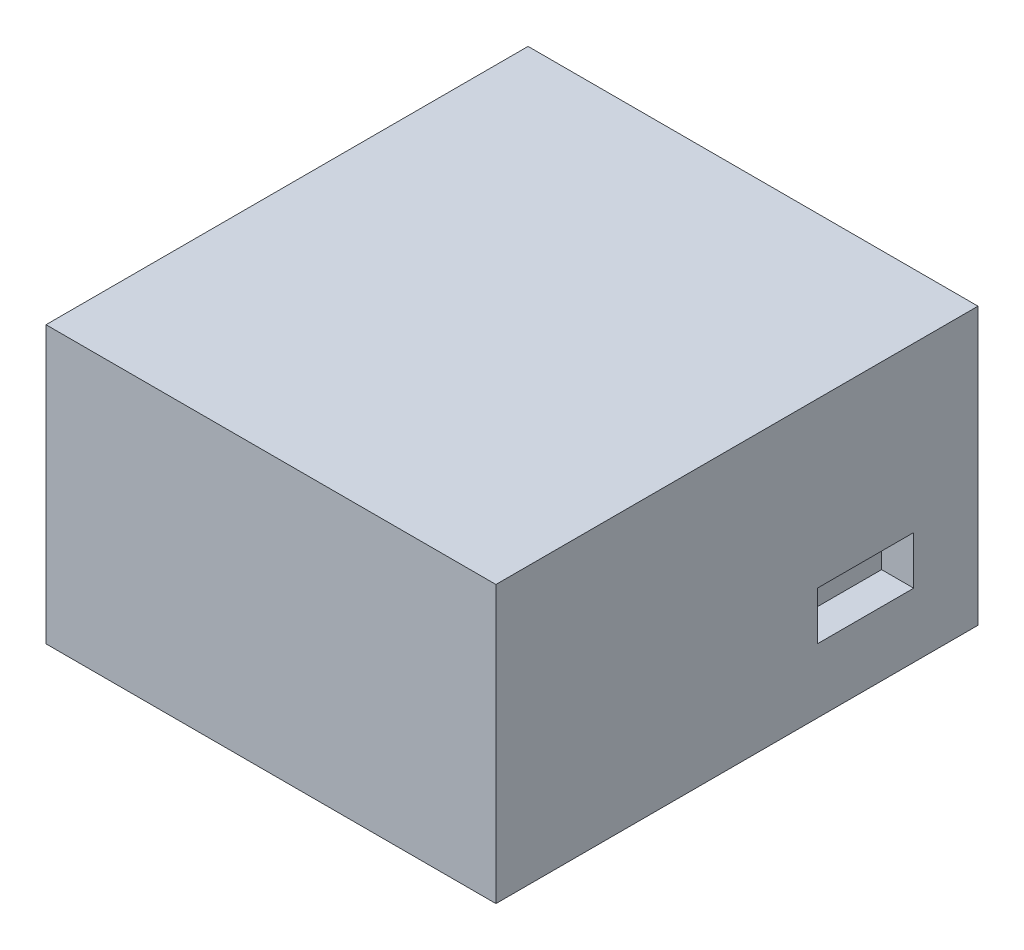
ISO-10303-21;
HEADER;
FILE_DESCRIPTION(('STEP AP214'),'2;1');
FILE_NAME('part.step','',(''),(''),'','','');
FILE_SCHEMA(('AUTOMOTIVE_DESIGN { 1 0 10303 214 1 1 1 1 }'));
ENDSEC;
DATA;
#1=APPLICATION_CONTEXT('core data for automotive mechanical design processes');
#2=APPLICATION_PROTOCOL_DEFINITION('international standard','automotive_design',2000,#1);
#3=PRODUCT_CONTEXT('',#1,'mechanical');
#4=PRODUCT('Part','Part','',(#3));
#5=PRODUCT_RELATED_PRODUCT_CATEGORY('part','',(#4));
#6=PRODUCT_DEFINITION_FORMATION('','',#4);
#7=PRODUCT_DEFINITION_CONTEXT('part definition',#1,'design');
#8=PRODUCT_DEFINITION('design','',#6,#7);
#9=PRODUCT_DEFINITION_SHAPE('','',#8);
#10=(LENGTH_UNIT() NAMED_UNIT(*) SI_UNIT(.MILLI.,.METRE.));
#11=(NAMED_UNIT(*) PLANE_ANGLE_UNIT() SI_UNIT($,.RADIAN.));
#12=(NAMED_UNIT(*) SI_UNIT($,.STERADIAN.) SOLID_ANGLE_UNIT());
#13=UNCERTAINTY_MEASURE_WITH_UNIT(LENGTH_MEASURE(1.E-05),#10,'distance_accuracy_value','');
#14=(GEOMETRIC_REPRESENTATION_CONTEXT(3) GLOBAL_UNCERTAINTY_ASSIGNED_CONTEXT((#13)) GLOBAL_UNIT_ASSIGNED_CONTEXT((#10,
#11,#12)) REPRESENTATION_CONTEXT('',''));
#15=CARTESIAN_POINT('',(0.,0.,0.));
#16=DIRECTION('',(0.,0.,1.));
#17=DIRECTION('',(1.,0.,0.));
#18=AXIS2_PLACEMENT_3D('',#15,#16,#17);
#19=CARTESIAN_POINT('',(70.,86.,75.));
#20=DIRECTION('',(-1.,0.,0.));
#21=DIRECTION('',(0.,0.,1.));
#22=AXIS2_PLACEMENT_3D('',#19,#20,#21);
#23=PLANE('',#22);
#24=DIRECTION('',(0.,0.,1.));
#25=VECTOR('',#24,1.);
#26=CARTESIAN_POINT('',(70.,35.,-25.));
#27=LINE('',#26,#25);
#28=CARTESIAN_POINT('',(70.,35.,-55.));
#29=VERTEX_POINT('',#28);
#30=CARTESIAN_POINT('',(70.,35.,-25.));
#31=VERTEX_POINT('',#30);
#32=EDGE_CURVE('E135',#29,#31,#27,.T.);
#33=ORIENTED_EDGE('',*,*,#32,.F.);
#34=DIRECTION('',(0.,1.,0.));
#35=VECTOR('',#34,1.);
#36=CARTESIAN_POINT('',(70.,35.,-55.));
#37=LINE('',#36,#35);
#38=CARTESIAN_POINT('',(70.,20.,-55.));
#39=VERTEX_POINT('',#38);
#40=EDGE_CURVE('E47',#39,#29,#37,.T.);
#41=ORIENTED_EDGE('',*,*,#40,.F.);
#42=DIRECTION('',(0.,0.,-1.));
#43=VECTOR('',#42,1.);
#44=CARTESIAN_POINT('',(70.,20.,-25.));
#45=LINE('',#44,#43);
#46=CARTESIAN_POINT('',(70.,20.,-25.));
#47=VERTEX_POINT('',#46);
#48=EDGE_CURVE('E126',#47,#39,#45,.T.);
#49=ORIENTED_EDGE('',*,*,#48,.F.);
#50=DIRECTION('',(0.,-1.,0.));
#51=VECTOR('',#50,1.);
#52=CARTESIAN_POINT('',(70.,35.,-25.));
#53=LINE('',#52,#51);
#54=EDGE_CURVE('E129',#31,#47,#53,.T.);
#55=ORIENTED_EDGE('',*,*,#54,.F.);
#56=EDGE_LOOP('',(#33,#41,#49,#55));
#57=FACE_BOUND('',#56,.T.);
#58=DIRECTION('',(0.,0.,-1.));
#59=VECTOR('',#58,1.);
#60=CARTESIAN_POINT('',(70.,0.,75.));
#61=LINE('',#60,#59);
#62=CARTESIAN_POINT('',(70.,0.,75.));
#63=VERTEX_POINT('',#62);
#64=CARTESIAN_POINT('',(70.,0.,-75.));
#65=VERTEX_POINT('',#64);
#66=EDGE_CURVE('E141',#63,#65,#61,.T.);
#67=ORIENTED_EDGE('',*,*,#66,.T.);
#68=DIRECTION('',(0.,-1.,0.));
#69=VECTOR('',#68,1.);
#70=CARTESIAN_POINT('',(70.,86.,-75.));
#71=LINE('',#70,#69);
#72=CARTESIAN_POINT('',(70.,86.,-75.));
#73=VERTEX_POINT('',#72);
#74=EDGE_CURVE('E11',#73,#65,#71,.T.);
#75=ORIENTED_EDGE('',*,*,#74,.F.);
#76=DIRECTION('',(0.,0.,-1.));
#77=VECTOR('',#76,1.);
#78=CARTESIAN_POINT('',(70.,86.,75.));
#79=LINE('',#78,#77);
#80=CARTESIAN_POINT('',(70.,86.,75.));
#81=VERTEX_POINT('',#80);
#82=EDGE_CURVE('E145',#81,#73,#79,.T.);
#83=ORIENTED_EDGE('',*,*,#82,.F.);
#84=DIRECTION('',(0.,-1.,0.));
#85=VECTOR('',#84,1.);
#86=CARTESIAN_POINT('',(70.,86.,75.));
#87=LINE('',#86,#85);
#88=EDGE_CURVE('E151',#81,#63,#87,.T.);
#89=ORIENTED_EDGE('',*,*,#88,.T.);
#90=EDGE_LOOP('',(#67,#75,#83,#89));
#91=FACE_BOUND('',#90,.T.);
#92=ADVANCED_FACE('F33',(#57,#91),#23,.F.);
#93=CARTESIAN_POINT('',(-70.,86.,-75.));
#94=DIRECTION('',(0.,0.,1.));
#95=DIRECTION('',(1.,0.,0.));
#96=AXIS2_PLACEMENT_3D('',#93,#94,#95);
#97=PLANE('',#96);
#98=DIRECTION('',(-1.,0.,0.));
#99=VECTOR('',#98,1.);
#100=CARTESIAN_POINT('',(-70.,0.,-75.));
#101=LINE('',#100,#99);
#102=CARTESIAN_POINT('',(-70.,0.,-75.));
#103=VERTEX_POINT('',#102);
#104=EDGE_CURVE('E154',#65,#103,#101,.T.);
#105=ORIENTED_EDGE('',*,*,#104,.T.);
#106=DIRECTION('',(0.,-1.,0.));
#107=VECTOR('',#106,1.);
#108=CARTESIAN_POINT('',(-70.,86.,-75.));
#109=LINE('',#108,#107);
#110=CARTESIAN_POINT('',(-70.,86.,-75.));
#111=VERTEX_POINT('',#110);
#112=EDGE_CURVE('E40',#111,#103,#109,.T.);
#113=ORIENTED_EDGE('',*,*,#112,.F.);
#114=DIRECTION('',(-1.,0.,0.));
#115=VECTOR('',#114,1.);
#116=CARTESIAN_POINT('',(-70.,86.,-75.));
#117=LINE('',#116,#115);
#118=EDGE_CURVE('E84',#73,#111,#117,.T.);
#119=ORIENTED_EDGE('',*,*,#118,.F.);
#120=ORIENTED_EDGE('',*,*,#74,.T.);
#121=EDGE_LOOP('',(#105,#113,#119,#120));
#122=FACE_BOUND('',#121,.T.);
#123=ADVANCED_FACE('F182',(#122),#97,.F.);
#124=CARTESIAN_POINT('',(-70.,86.,75.));
#125=DIRECTION('',(1.,0.,0.));
#126=DIRECTION('',(0.,0.,-1.));
#127=AXIS2_PLACEMENT_3D('',#124,#125,#126);
#128=PLANE('',#127);
#129=DIRECTION('',(0.,0.,1.));
#130=VECTOR('',#129,1.);
#131=CARTESIAN_POINT('',(-70.,0.,75.));
#132=LINE('',#131,#130);
#133=CARTESIAN_POINT('',(-70.,0.,75.));
#134=VERTEX_POINT('',#133);
#135=EDGE_CURVE('E156',#103,#134,#132,.T.);
#136=ORIENTED_EDGE('',*,*,#135,.T.);
#137=DIRECTION('',(0.,-1.,0.));
#138=VECTOR('',#137,1.);
#139=CARTESIAN_POINT('',(-70.,86.,75.));
#140=LINE('',#139,#138);
#141=CARTESIAN_POINT('',(-70.,86.,75.));
#142=VERTEX_POINT('',#141);
#143=EDGE_CURVE('E160',#142,#134,#140,.T.);
#144=ORIENTED_EDGE('',*,*,#143,.F.);
#145=DIRECTION('',(0.,0.,1.));
#146=VECTOR('',#145,1.);
#147=CARTESIAN_POINT('',(-70.,86.,75.));
#148=LINE('',#147,#146);
#149=EDGE_CURVE('E148',#111,#142,#148,.T.);
#150=ORIENTED_EDGE('',*,*,#149,.F.);
#151=ORIENTED_EDGE('',*,*,#112,.T.);
#152=EDGE_LOOP('',(#136,#144,#150,#151));
#153=FACE_BOUND('',#152,.T.);
#154=ADVANCED_FACE('F165',(#153),#128,.F.);
#155=CARTESIAN_POINT('',(-70.,86.,75.));
#156=DIRECTION('',(0.,0.,-1.));
#157=DIRECTION('',(-1.,0.,0.));
#158=AXIS2_PLACEMENT_3D('',#155,#156,#157);
#159=PLANE('',#158);
#160=DIRECTION('',(1.,0.,0.));
#161=VECTOR('',#160,1.);
#162=CARTESIAN_POINT('',(-70.,0.,75.));
#163=LINE('',#162,#161);
#164=EDGE_CURVE('E77',#134,#63,#163,.T.);
#165=ORIENTED_EDGE('',*,*,#164,.T.);
#166=ORIENTED_EDGE('',*,*,#88,.F.);
#167=DIRECTION('',(1.,0.,0.));
#168=VECTOR('',#167,1.);
#169=CARTESIAN_POINT('',(-70.,86.,75.));
#170=LINE('',#169,#168);
#171=EDGE_CURVE('E56',#142,#81,#170,.T.);
#172=ORIENTED_EDGE('',*,*,#171,.F.);
#173=ORIENTED_EDGE('',*,*,#143,.T.);
#174=EDGE_LOOP('',(#165,#166,#172,#173));
#175=FACE_BOUND('',#174,.T.);
#176=ADVANCED_FACE('F173',(#175),#159,.F.);
#177=CARTESIAN_POINT('',(0.,86.,0.));
#178=DIRECTION('',(0.,-1.,0.));
#179=DIRECTION('',(0.,0.,-1.));
#180=AXIS2_PLACEMENT_3D('',#177,#178,#179);
#181=PLANE('',#180);
#182=ORIENTED_EDGE('',*,*,#82,.T.);
#183=ORIENTED_EDGE('',*,*,#118,.T.);
#184=ORIENTED_EDGE('',*,*,#149,.T.);
#185=ORIENTED_EDGE('',*,*,#171,.T.);
#186=EDGE_LOOP('',(#182,#183,#184,#185));
#187=FACE_BOUND('',#186,.T.);
#188=ADVANCED_FACE('F175',(#187),#181,.F.);
#189=CARTESIAN_POINT('',(0.,0.,0.));
#190=DIRECTION('',(0.,-1.,0.));
#191=DIRECTION('',(0.,0.,-1.));
#192=AXIS2_PLACEMENT_3D('',#189,#190,#191);
#193=PLANE('',#192);
#194=ORIENTED_EDGE('',*,*,#66,.F.);
#195=ORIENTED_EDGE('',*,*,#164,.F.);
#196=ORIENTED_EDGE('',*,*,#135,.F.);
#197=ORIENTED_EDGE('',*,*,#104,.F.);
#198=EDGE_LOOP('',(#194,#195,#196,#197));
#199=FACE_BOUND('',#198,.T.);
#200=ADVANCED_FACE('F169',(#199),#193,.T.);
#201=CARTESIAN_POINT('',(60.,35.,-55.));
#202=DIRECTION('',(0.,0.,-1.));
#203=DIRECTION('',(-1.,0.,0.));
#204=AXIS2_PLACEMENT_3D('',#201,#202,#203);
#205=PLANE('',#204);
#206=ORIENTED_EDGE('',*,*,#40,.T.);
#207=DIRECTION('',(1.,0.,0.));
#208=VECTOR('',#207,1.);
#209=CARTESIAN_POINT('',(60.,35.,-55.));
#210=LINE('',#209,#208);
#211=CARTESIAN_POINT('',(60.,35.,-55.));
#212=VERTEX_POINT('',#211);
#213=EDGE_CURVE('E104',#212,#29,#210,.T.);
#214=ORIENTED_EDGE('',*,*,#213,.F.);
#215=DIRECTION('',(0.,1.,0.));
#216=VECTOR('',#215,1.);
#217=CARTESIAN_POINT('',(60.,35.,-55.));
#218=LINE('',#217,#216);
#219=CARTESIAN_POINT('',(60.,20.,-55.));
#220=VERTEX_POINT('',#219);
#221=EDGE_CURVE('E108',#220,#212,#218,.T.);
#222=ORIENTED_EDGE('',*,*,#221,.F.);
#223=DIRECTION('',(1.,0.,0.));
#224=VECTOR('',#223,1.);
#225=CARTESIAN_POINT('',(60.,20.,-55.));
#226=LINE('',#225,#224);
#227=EDGE_CURVE('E139',#220,#39,#226,.T.);
#228=ORIENTED_EDGE('',*,*,#227,.T.);
#229=EDGE_LOOP('',(#206,#214,#222,#228));
#230=FACE_BOUND('',#229,.T.);
#231=ADVANCED_FACE('F106',(#230),#205,.F.);
#232=CARTESIAN_POINT('',(60.,20.,-25.));
#233=DIRECTION('',(0.,-1.,0.));
#234=DIRECTION('',(0.,0.,-1.));
#235=AXIS2_PLACEMENT_3D('',#232,#233,#234);
#236=PLANE('',#235);
#237=ORIENTED_EDGE('',*,*,#48,.T.);
#238=ORIENTED_EDGE('',*,*,#227,.F.);
#239=DIRECTION('',(0.,0.,-1.));
#240=VECTOR('',#239,1.);
#241=CARTESIAN_POINT('',(60.,20.,-25.));
#242=LINE('',#241,#240);
#243=CARTESIAN_POINT('',(60.,20.,-25.));
#244=VERTEX_POINT('',#243);
#245=EDGE_CURVE('E114',#244,#220,#242,.T.);
#246=ORIENTED_EDGE('',*,*,#245,.F.);
#247=DIRECTION('',(1.,0.,0.));
#248=VECTOR('',#247,1.);
#249=CARTESIAN_POINT('',(60.,20.,-25.));
#250=LINE('',#249,#248);
#251=EDGE_CURVE('E142',#244,#47,#250,.T.);
#252=ORIENTED_EDGE('',*,*,#251,.T.);
#253=EDGE_LOOP('',(#237,#238,#246,#252));
#254=FACE_BOUND('',#253,.T.);
#255=ADVANCED_FACE('F195',(#254),#236,.F.);
#256=CARTESIAN_POINT('',(60.,35.,-25.));
#257=DIRECTION('',(0.,0.,1.));
#258=DIRECTION('',(0.,-1.,0.));
#259=AXIS2_PLACEMENT_3D('',#256,#257,#258);
#260=PLANE('',#259);
#261=ORIENTED_EDGE('',*,*,#54,.T.);
#262=ORIENTED_EDGE('',*,*,#251,.F.);
#263=DIRECTION('',(0.,-1.,0.));
#264=VECTOR('',#263,1.);
#265=CARTESIAN_POINT('',(60.,35.,-25.));
#266=LINE('',#265,#264);
#267=CARTESIAN_POINT('',(60.,35.,-25.));
#268=VERTEX_POINT('',#267);
#269=EDGE_CURVE('E122',#268,#244,#266,.T.);
#270=ORIENTED_EDGE('',*,*,#269,.F.);
#271=DIRECTION('',(1.,0.,0.));
#272=VECTOR('',#271,1.);
#273=CARTESIAN_POINT('',(60.,35.,-25.));
#274=LINE('',#273,#272);
#275=EDGE_CURVE('E113',#268,#31,#274,.T.);
#276=ORIENTED_EDGE('',*,*,#275,.T.);
#277=EDGE_LOOP('',(#261,#262,#270,#276));
#278=FACE_BOUND('',#277,.T.);
#279=ADVANCED_FACE('F193',(#278),#260,.F.);
#280=CARTESIAN_POINT('',(60.,35.,-25.));
#281=DIRECTION('',(0.,1.,0.));
#282=DIRECTION('',(0.,0.,1.));
#283=AXIS2_PLACEMENT_3D('',#280,#281,#282);
#284=PLANE('',#283);
#285=ORIENTED_EDGE('',*,*,#32,.T.);
#286=ORIENTED_EDGE('',*,*,#275,.F.);
#287=DIRECTION('',(0.,0.,1.));
#288=VECTOR('',#287,1.);
#289=CARTESIAN_POINT('',(60.,35.,-25.));
#290=LINE('',#289,#288);
#291=EDGE_CURVE('E117',#212,#268,#290,.T.);
#292=ORIENTED_EDGE('',*,*,#291,.F.);
#293=ORIENTED_EDGE('',*,*,#213,.T.);
#294=EDGE_LOOP('',(#285,#286,#292,#293));
#295=FACE_BOUND('',#294,.T.);
#296=ADVANCED_FACE('F118',(#295),#284,.F.);
#297=CARTESIAN_POINT('',(60.,0.,0.));
#298=DIRECTION('',(1.,0.,0.));
#299=DIRECTION('',(0.,0.,-1.));
#300=AXIS2_PLACEMENT_3D('',#297,#298,#299);
#301=PLANE('',#300);
#302=ORIENTED_EDGE('',*,*,#221,.T.);
#303=ORIENTED_EDGE('',*,*,#291,.T.);
#304=ORIENTED_EDGE('',*,*,#269,.T.);
#305=ORIENTED_EDGE('',*,*,#245,.T.);
#306=EDGE_LOOP('',(#302,#303,#304,#305));
#307=FACE_BOUND('',#306,.T.);
#308=ADVANCED_FACE('F124',(#307),#301,.T.);
#309=CLOSED_SHELL('',(#92,#123,#154,#176,#188,#200,#231,#255,#279,#296,#308));
#310=MANIFOLD_SOLID_BREP('B2',#309);
#311=ADVANCED_BREP_SHAPE_REPRESENTATION('',(#18,#310),#14);
#312=SHAPE_DEFINITION_REPRESENTATION(#9,#311);
ENDSEC;
END-ISO-10303-21;
